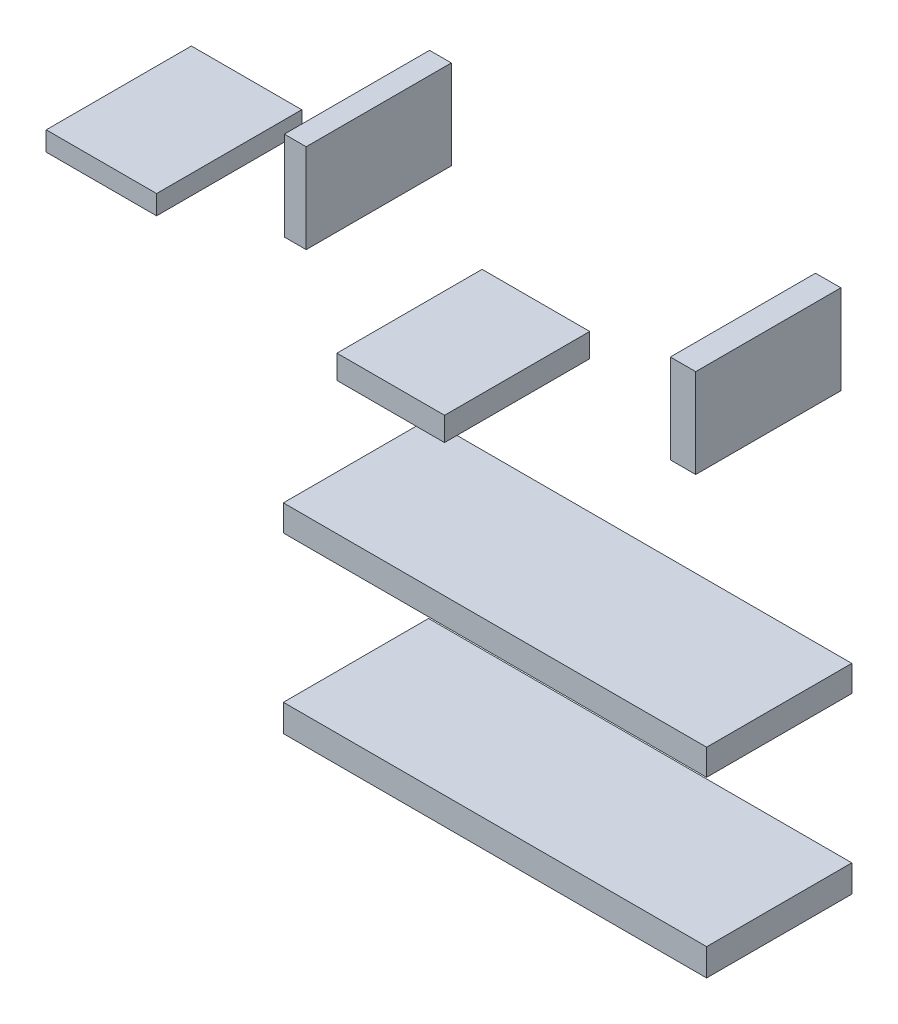
ISO-10303-21;
HEADER;
FILE_DESCRIPTION(('STEP AP214'),'2;1');
FILE_NAME('part.step','',(''),(''),'','','');
FILE_SCHEMA(('AUTOMOTIVE_DESIGN { 1 0 10303 214 1 1 1 1 }'));
ENDSEC;
DATA;
#1=APPLICATION_CONTEXT('core data for automotive mechanical design processes');
#2=APPLICATION_PROTOCOL_DEFINITION('international standard','automotive_design',2000,#1);
#3=PRODUCT_CONTEXT('',#1,'mechanical');
#4=PRODUCT('Part','Part','',(#3));
#5=PRODUCT_RELATED_PRODUCT_CATEGORY('part','',(#4));
#6=PRODUCT_DEFINITION_FORMATION('','',#4);
#7=PRODUCT_DEFINITION_CONTEXT('part definition',#1,'design');
#8=PRODUCT_DEFINITION('design','',#6,#7);
#9=PRODUCT_DEFINITION_SHAPE('','',#8);
#10=(LENGTH_UNIT() NAMED_UNIT(*) SI_UNIT(.MILLI.,.METRE.));
#11=(NAMED_UNIT(*) PLANE_ANGLE_UNIT() SI_UNIT($,.RADIAN.));
#12=(NAMED_UNIT(*) SI_UNIT($,.STERADIAN.) SOLID_ANGLE_UNIT());
#13=UNCERTAINTY_MEASURE_WITH_UNIT(LENGTH_MEASURE(1.E-05),#10,'distance_accuracy_value','');
#14=(GEOMETRIC_REPRESENTATION_CONTEXT(3) GLOBAL_UNCERTAINTY_ASSIGNED_CONTEXT((#13)) GLOBAL_UNIT_ASSIGNED_CONTEXT((#10,
#11,#12)) REPRESENTATION_CONTEXT('',''));
#15=CARTESIAN_POINT('',(0.,0.,0.));
#16=DIRECTION('',(0.,0.,1.));
#17=DIRECTION('',(1.,0.,0.));
#18=AXIS2_PLACEMENT_3D('',#15,#16,#17);
#19=CARTESIAN_POINT('',(-5.75548162999998,-30.9664164103359,-13.));
#20=DIRECTION('',(-1.,0.,0.));
#21=DIRECTION('',(0.,0.,1.));
#22=AXIS2_PLACEMENT_3D('',#19,#20,#21);
#23=PLANE('',#22);
#24=DIRECTION('',(0.,-1.,0.));
#25=VECTOR('',#24,1.);
#26=CARTESIAN_POINT('',(-5.75548162999998,-30.9664164103359,0.));
#27=LINE('',#26,#25);
#28=CARTESIAN_POINT('',(-5.75548162999998,-30.9664164103359,0.));
#29=VERTEX_POINT('',#28);
#30=CARTESIAN_POINT('',(-5.75548162999998,-33.4,0.));
#31=VERTEX_POINT('',#30);
#32=EDGE_CURVE('E107',#29,#31,#27,.T.);
#33=ORIENTED_EDGE('',*,*,#32,.F.);
#34=DIRECTION('',(0.,0.,1.));
#35=VECTOR('',#34,1.);
#36=CARTESIAN_POINT('',(-5.75548162999998,-30.9664164103359,-13.));
#37=LINE('',#36,#35);
#38=CARTESIAN_POINT('',(-5.75548162999998,-30.9664164103359,-13.));
#39=VERTEX_POINT('',#38);
#40=EDGE_CURVE('E12',#39,#29,#37,.T.);
#41=ORIENTED_EDGE('',*,*,#40,.F.);
#42=DIRECTION('',(0.,-1.,0.));
#43=VECTOR('',#42,1.);
#44=CARTESIAN_POINT('',(-5.75548162999998,-30.9664164103359,-13.));
#45=LINE('',#44,#43);
#46=CARTESIAN_POINT('',(-5.75548162999998,-33.4,-13.));
#47=VERTEX_POINT('',#46);
#48=EDGE_CURVE('E101',#39,#47,#45,.T.);
#49=ORIENTED_EDGE('',*,*,#48,.T.);
#50=DIRECTION('',(0.,0.,1.));
#51=VECTOR('',#50,1.);
#52=CARTESIAN_POINT('',(-5.75548162999998,-33.4,-13.));
#53=LINE('',#52,#51);
#54=EDGE_CURVE('E46',#47,#31,#53,.T.);
#55=ORIENTED_EDGE('',*,*,#54,.T.);
#56=EDGE_LOOP('',(#33,#41,#49,#55));
#57=FACE_BOUND('',#56,.T.);
#58=ADVANCED_FACE('F43',(#57),#23,.T.);
#59=CARTESIAN_POINT('',(-5.75548162999998,-30.9664164103359,-13.));
#60=DIRECTION('',(0.,1.,0.));
#61=DIRECTION('',(0.,0.,1.));
#62=AXIS2_PLACEMENT_3D('',#59,#60,#61);
#63=PLANE('',#62);
#64=DIRECTION('',(-1.,0.,0.));
#65=VECTOR('',#64,1.);
#66=CARTESIAN_POINT('',(-5.75548162999998,-30.9664164103359,0.));
#67=LINE('',#66,#65);
#68=CARTESIAN_POINT('',(32.14451837,-30.9664164103359,0.));
#69=VERTEX_POINT('',#68);
#70=EDGE_CURVE('E103',#69,#29,#67,.T.);
#71=ORIENTED_EDGE('',*,*,#70,.F.);
#72=DIRECTION('',(0.,0.,1.));
#73=VECTOR('',#72,1.);
#74=CARTESIAN_POINT('',(32.14451837,-30.9664164103359,-13.));
#75=LINE('',#74,#73);
#76=CARTESIAN_POINT('',(32.14451837,-30.9664164103359,-13.));
#77=VERTEX_POINT('',#76);
#78=EDGE_CURVE('E52',#77,#69,#75,.T.);
#79=ORIENTED_EDGE('',*,*,#78,.F.);
#80=DIRECTION('',(-1.,0.,0.));
#81=VECTOR('',#80,1.);
#82=CARTESIAN_POINT('',(-5.75548162999998,-30.9664164103359,-13.));
#83=LINE('',#82,#81);
#84=EDGE_CURVE('E98',#77,#39,#83,.T.);
#85=ORIENTED_EDGE('',*,*,#84,.T.);
#86=ORIENTED_EDGE('',*,*,#40,.T.);
#87=EDGE_LOOP('',(#71,#79,#85,#86));
#88=FACE_BOUND('',#87,.T.);
#89=ADVANCED_FACE('F117',(#88),#63,.T.);
#90=CARTESIAN_POINT('',(32.14451837,-30.9664164103359,-13.));
#91=DIRECTION('',(1.,0.,0.));
#92=DIRECTION('',(0.,0.,-1.));
#93=AXIS2_PLACEMENT_3D('',#90,#91,#92);
#94=PLANE('',#93);
#95=DIRECTION('',(0.,1.,0.));
#96=VECTOR('',#95,1.);
#97=CARTESIAN_POINT('',(32.14451837,-30.9664164103359,0.));
#98=LINE('',#97,#96);
#99=CARTESIAN_POINT('',(32.14451837,-33.4,0.));
#100=VERTEX_POINT('',#99);
#101=EDGE_CURVE('E93',#100,#69,#98,.T.);
#102=ORIENTED_EDGE('',*,*,#101,.F.);
#103=DIRECTION('',(0.,0.,1.));
#104=VECTOR('',#103,1.);
#105=CARTESIAN_POINT('',(32.14451837,-33.4,-13.));
#106=LINE('',#105,#104);
#107=CARTESIAN_POINT('',(32.14451837,-33.4,-13.));
#108=VERTEX_POINT('',#107);
#109=EDGE_CURVE('E88',#108,#100,#106,.T.);
#110=ORIENTED_EDGE('',*,*,#109,.F.);
#111=DIRECTION('',(0.,1.,0.));
#112=VECTOR('',#111,1.);
#113=CARTESIAN_POINT('',(32.14451837,-30.9664164103359,-13.));
#114=LINE('',#113,#112);
#115=EDGE_CURVE('E91',#108,#77,#114,.T.);
#116=ORIENTED_EDGE('',*,*,#115,.T.);
#117=ORIENTED_EDGE('',*,*,#78,.T.);
#118=EDGE_LOOP('',(#102,#110,#116,#117));
#119=FACE_BOUND('',#118,.T.);
#120=ADVANCED_FACE('F90',(#119),#94,.T.);
#121=CARTESIAN_POINT('',(-5.75548162999998,-33.4,-13.));
#122=DIRECTION('',(0.,-1.,0.));
#123=DIRECTION('',(0.,0.,-1.));
#124=AXIS2_PLACEMENT_3D('',#121,#122,#123);
#125=PLANE('',#124);
#126=DIRECTION('',(1.,0.,0.));
#127=VECTOR('',#126,1.);
#128=CARTESIAN_POINT('',(-5.75548162999998,-33.4,0.));
#129=LINE('',#128,#127);
#130=EDGE_CURVE('E110',#31,#100,#129,.T.);
#131=ORIENTED_EDGE('',*,*,#130,.F.);
#132=ORIENTED_EDGE('',*,*,#54,.F.);
#133=DIRECTION('',(1.,0.,0.));
#134=VECTOR('',#133,1.);
#135=CARTESIAN_POINT('',(-5.75548162999998,-33.4,-13.));
#136=LINE('',#135,#134);
#137=EDGE_CURVE('E97',#47,#108,#136,.T.);
#138=ORIENTED_EDGE('',*,*,#137,.T.);
#139=ORIENTED_EDGE('',*,*,#109,.T.);
#140=EDGE_LOOP('',(#131,#132,#138,#139));
#141=FACE_BOUND('',#140,.T.);
#142=ADVANCED_FACE('F100',(#141),#125,.T.);
#143=CARTESIAN_POINT('',(0.,0.,-13.));
#144=DIRECTION('',(0.,0.,1.));
#145=DIRECTION('',(1.,0.,0.));
#146=AXIS2_PLACEMENT_3D('',#143,#144,#145);
#147=PLANE('',#146);
#148=ORIENTED_EDGE('',*,*,#48,.F.);
#149=ORIENTED_EDGE('',*,*,#84,.F.);
#150=ORIENTED_EDGE('',*,*,#115,.F.);
#151=ORIENTED_EDGE('',*,*,#137,.F.);
#152=EDGE_LOOP('',(#148,#149,#150,#151));
#153=FACE_BOUND('',#152,.T.);
#154=ADVANCED_FACE('F96',(#153),#147,.F.);
#155=CARTESIAN_POINT('',(0.,0.,0.));
#156=DIRECTION('',(0.,0.,1.));
#157=DIRECTION('',(1.,0.,0.));
#158=AXIS2_PLACEMENT_3D('',#155,#156,#157);
#159=PLANE('',#158);
#160=ORIENTED_EDGE('',*,*,#32,.T.);
#161=ORIENTED_EDGE('',*,*,#130,.T.);
#162=ORIENTED_EDGE('',*,*,#101,.T.);
#163=ORIENTED_EDGE('',*,*,#70,.T.);
#164=EDGE_LOOP('',(#160,#161,#162,#163));
#165=FACE_BOUND('',#164,.T.);
#166=ADVANCED_FACE('F116',(#165),#159,.T.);
#167=CLOSED_SHELL('',(#58,#89,#120,#142,#154,#166));
#168=MANIFOLD_SOLID_BREP('B2',#167);
#169=CARTESIAN_POINT('',(-5.75548162999998,-15.5,-13.));
#170=DIRECTION('',(-1.,0.,0.));
#171=DIRECTION('',(0.,0.,1.));
#172=AXIS2_PLACEMENT_3D('',#169,#170,#171);
#173=PLANE('',#172);
#174=DIRECTION('',(0.,-1.,0.));
#175=VECTOR('',#174,1.);
#176=CARTESIAN_POINT('',(-5.75548162999998,-15.5,0.));
#177=LINE('',#176,#175);
#178=CARTESIAN_POINT('',(-5.75548162999998,-15.5,0.));
#179=VERTEX_POINT('',#178);
#180=CARTESIAN_POINT('',(-5.75548162999998,-17.84,0.));
#181=VERTEX_POINT('',#180);
#182=EDGE_CURVE('E240',#179,#181,#177,.T.);
#183=ORIENTED_EDGE('',*,*,#182,.F.);
#184=DIRECTION('',(0.,0.,1.));
#185=VECTOR('',#184,1.);
#186=CARTESIAN_POINT('',(-5.75548162999998,-15.5,-13.));
#187=LINE('',#186,#185);
#188=CARTESIAN_POINT('',(-5.75548162999998,-15.5,-13.));
#189=VERTEX_POINT('',#188);
#190=EDGE_CURVE('E41',#189,#179,#187,.T.);
#191=ORIENTED_EDGE('',*,*,#190,.F.);
#192=DIRECTION('',(0.,-1.,0.));
#193=VECTOR('',#192,1.);
#194=CARTESIAN_POINT('',(-5.75548162999998,-15.5,-13.));
#195=LINE('',#194,#193);
#196=CARTESIAN_POINT('',(-5.75548162999998,-17.84,-13.));
#197=VERTEX_POINT('',#196);
#198=EDGE_CURVE('E234',#189,#197,#195,.T.);
#199=ORIENTED_EDGE('',*,*,#198,.T.);
#200=DIRECTION('',(0.,0.,1.));
#201=VECTOR('',#200,1.);
#202=CARTESIAN_POINT('',(-5.75548162999998,-17.84,-13.));
#203=LINE('',#202,#201);
#204=EDGE_CURVE('E179',#197,#181,#203,.T.);
#205=ORIENTED_EDGE('',*,*,#204,.T.);
#206=EDGE_LOOP('',(#183,#191,#199,#205));
#207=FACE_BOUND('',#206,.T.);
#208=ADVANCED_FACE('F176',(#207),#173,.T.);
#209=CARTESIAN_POINT('',(-5.75548162999998,-15.5,-13.));
#210=DIRECTION('',(0.,1.,0.));
#211=DIRECTION('',(0.,0.,1.));
#212=AXIS2_PLACEMENT_3D('',#209,#210,#211);
#213=PLANE('',#212);
#214=DIRECTION('',(-1.,0.,0.));
#215=VECTOR('',#214,1.);
#216=CARTESIAN_POINT('',(-5.75548162999998,-15.5,0.));
#217=LINE('',#216,#215);
#218=CARTESIAN_POINT('',(32.14451837,-15.5,0.));
#219=VERTEX_POINT('',#218);
#220=EDGE_CURVE('E236',#219,#179,#217,.T.);
#221=ORIENTED_EDGE('',*,*,#220,.F.);
#222=DIRECTION('',(0.,0.,1.));
#223=VECTOR('',#222,1.);
#224=CARTESIAN_POINT('',(32.14451837,-15.5,-13.));
#225=LINE('',#224,#223);
#226=CARTESIAN_POINT('',(32.14451837,-15.5,-13.));
#227=VERTEX_POINT('',#226);
#228=EDGE_CURVE('E185',#227,#219,#225,.T.);
#229=ORIENTED_EDGE('',*,*,#228,.F.);
#230=DIRECTION('',(-1.,0.,0.));
#231=VECTOR('',#230,1.);
#232=CARTESIAN_POINT('',(-5.75548162999998,-15.5,-13.));
#233=LINE('',#232,#231);
#234=EDGE_CURVE('E231',#227,#189,#233,.T.);
#235=ORIENTED_EDGE('',*,*,#234,.T.);
#236=ORIENTED_EDGE('',*,*,#190,.T.);
#237=EDGE_LOOP('',(#221,#229,#235,#236));
#238=FACE_BOUND('',#237,.T.);
#239=ADVANCED_FACE('F250',(#238),#213,.T.);
#240=CARTESIAN_POINT('',(32.14451837,-15.5,-13.));
#241=DIRECTION('',(1.,0.,0.));
#242=DIRECTION('',(0.,0.,-1.));
#243=AXIS2_PLACEMENT_3D('',#240,#241,#242);
#244=PLANE('',#243);
#245=DIRECTION('',(0.,1.,0.));
#246=VECTOR('',#245,1.);
#247=CARTESIAN_POINT('',(32.14451837,-15.5,0.));
#248=LINE('',#247,#246);
#249=CARTESIAN_POINT('',(32.14451837,-17.84,0.));
#250=VERTEX_POINT('',#249);
#251=EDGE_CURVE('E226',#250,#219,#248,.T.);
#252=ORIENTED_EDGE('',*,*,#251,.F.);
#253=DIRECTION('',(0.,0.,1.));
#254=VECTOR('',#253,1.);
#255=CARTESIAN_POINT('',(32.14451837,-17.84,-13.));
#256=LINE('',#255,#254);
#257=CARTESIAN_POINT('',(32.14451837,-17.84,-13.));
#258=VERTEX_POINT('',#257);
#259=EDGE_CURVE('E221',#258,#250,#256,.T.);
#260=ORIENTED_EDGE('',*,*,#259,.F.);
#261=DIRECTION('',(0.,1.,0.));
#262=VECTOR('',#261,1.);
#263=CARTESIAN_POINT('',(32.14451837,-15.5,-13.));
#264=LINE('',#263,#262);
#265=EDGE_CURVE('E224',#258,#227,#264,.T.);
#266=ORIENTED_EDGE('',*,*,#265,.T.);
#267=ORIENTED_EDGE('',*,*,#228,.T.);
#268=EDGE_LOOP('',(#252,#260,#266,#267));
#269=FACE_BOUND('',#268,.T.);
#270=ADVANCED_FACE('F223',(#269),#244,.T.);
#271=CARTESIAN_POINT('',(-5.75548162999998,-17.84,-13.));
#272=DIRECTION('',(0.,-1.,0.));
#273=DIRECTION('',(0.,0.,-1.));
#274=AXIS2_PLACEMENT_3D('',#271,#272,#273);
#275=PLANE('',#274);
#276=DIRECTION('',(1.,0.,0.));
#277=VECTOR('',#276,1.);
#278=CARTESIAN_POINT('',(-5.75548162999998,-17.84,0.));
#279=LINE('',#278,#277);
#280=EDGE_CURVE('E243',#181,#250,#279,.T.);
#281=ORIENTED_EDGE('',*,*,#280,.F.);
#282=ORIENTED_EDGE('',*,*,#204,.F.);
#283=DIRECTION('',(1.,0.,0.));
#284=VECTOR('',#283,1.);
#285=CARTESIAN_POINT('',(-5.75548162999998,-17.84,-13.));
#286=LINE('',#285,#284);
#287=EDGE_CURVE('E230',#197,#258,#286,.T.);
#288=ORIENTED_EDGE('',*,*,#287,.T.);
#289=ORIENTED_EDGE('',*,*,#259,.T.);
#290=EDGE_LOOP('',(#281,#282,#288,#289));
#291=FACE_BOUND('',#290,.T.);
#292=ADVANCED_FACE('F233',(#291),#275,.T.);
#293=CARTESIAN_POINT('',(0.,0.,-13.));
#294=DIRECTION('',(0.,0.,1.));
#295=DIRECTION('',(1.,0.,0.));
#296=AXIS2_PLACEMENT_3D('',#293,#294,#295);
#297=PLANE('',#296);
#298=ORIENTED_EDGE('',*,*,#198,.F.);
#299=ORIENTED_EDGE('',*,*,#234,.F.);
#300=ORIENTED_EDGE('',*,*,#265,.F.);
#301=ORIENTED_EDGE('',*,*,#287,.F.);
#302=EDGE_LOOP('',(#298,#299,#300,#301));
#303=FACE_BOUND('',#302,.T.);
#304=ADVANCED_FACE('F229',(#303),#297,.F.);
#305=CARTESIAN_POINT('',(0.,0.,0.));
#306=DIRECTION('',(0.,0.,1.));
#307=DIRECTION('',(1.,0.,0.));
#308=AXIS2_PLACEMENT_3D('',#305,#306,#307);
#309=PLANE('',#308);
#310=ORIENTED_EDGE('',*,*,#182,.T.);
#311=ORIENTED_EDGE('',*,*,#280,.T.);
#312=ORIENTED_EDGE('',*,*,#251,.T.);
#313=ORIENTED_EDGE('',*,*,#220,.T.);
#314=EDGE_LOOP('',(#310,#311,#312,#313));
#315=FACE_BOUND('',#314,.T.);
#316=ADVANCED_FACE('F249',(#315),#309,.T.);
#317=CLOSED_SHELL('',(#208,#239,#270,#292,#304,#316));
#318=MANIFOLD_SOLID_BREP('B6',#317);
#319=CARTESIAN_POINT('',(28.8972751093144,13.1375005908331,-13.));
#320=DIRECTION('',(-1.,0.,0.));
#321=DIRECTION('',(0.,0.,1.));
#322=AXIS2_PLACEMENT_3D('',#319,#320,#321);
#323=PLANE('',#322);
#324=DIRECTION('',(0.,-1.,0.));
#325=VECTOR('',#324,1.);
#326=CARTESIAN_POINT('',(28.8972751093144,13.1375005908331,0.));
#327=LINE('',#326,#325);
#328=CARTESIAN_POINT('',(28.8972751093144,13.1375005908331,0.));
#329=VERTEX_POINT('',#328);
#330=CARTESIAN_POINT('',(28.8972751093144,5.15433496295749,0.));
#331=VERTEX_POINT('',#330);
#332=EDGE_CURVE('E373',#329,#331,#327,.T.);
#333=ORIENTED_EDGE('',*,*,#332,.F.);
#334=DIRECTION('',(0.,0.,1.));
#335=VECTOR('',#334,1.);
#336=CARTESIAN_POINT('',(28.8972751093144,13.1375005908331,-13.));
#337=LINE('',#336,#335);
#338=CARTESIAN_POINT('',(28.8972751093144,13.1375005908331,-13.));
#339=VERTEX_POINT('',#338);
#340=EDGE_CURVE('E174',#339,#329,#337,.T.);
#341=ORIENTED_EDGE('',*,*,#340,.F.);
#342=DIRECTION('',(0.,-1.,0.));
#343=VECTOR('',#342,1.);
#344=CARTESIAN_POINT('',(28.8972751093144,13.1375005908331,-13.));
#345=LINE('',#344,#343);
#346=CARTESIAN_POINT('',(28.8972751093144,5.15433496295749,-13.));
#347=VERTEX_POINT('',#346);
#348=EDGE_CURVE('E367',#339,#347,#345,.T.);
#349=ORIENTED_EDGE('',*,*,#348,.T.);
#350=DIRECTION('',(0.,0.,1.));
#351=VECTOR('',#350,1.);
#352=CARTESIAN_POINT('',(28.8972751093144,5.15433496295749,-13.));
#353=LINE('',#352,#351);
#354=EDGE_CURVE('E312',#347,#331,#353,.T.);
#355=ORIENTED_EDGE('',*,*,#354,.T.);
#356=EDGE_LOOP('',(#333,#341,#349,#355));
#357=FACE_BOUND('',#356,.T.);
#358=ADVANCED_FACE('F309',(#357),#323,.T.);
#359=CARTESIAN_POINT('',(28.8972751093144,13.1375005908331,-13.));
#360=DIRECTION('',(0.,1.,0.));
#361=DIRECTION('',(0.,0.,1.));
#362=AXIS2_PLACEMENT_3D('',#359,#360,#361);
#363=PLANE('',#362);
#364=DIRECTION('',(-1.,0.,0.));
#365=VECTOR('',#364,1.);
#366=CARTESIAN_POINT('',(28.8972751093144,13.1375005908331,0.));
#367=LINE('',#366,#365);
#368=CARTESIAN_POINT('',(31.1665691583331,13.1375005908331,0.));
#369=VERTEX_POINT('',#368);
#370=EDGE_CURVE('E369',#369,#329,#367,.T.);
#371=ORIENTED_EDGE('',*,*,#370,.F.);
#372=DIRECTION('',(0.,0.,1.));
#373=VECTOR('',#372,1.);
#374=CARTESIAN_POINT('',(31.1665691583331,13.1375005908331,-13.));
#375=LINE('',#374,#373);
#376=CARTESIAN_POINT('',(31.1665691583331,13.1375005908331,-13.));
#377=VERTEX_POINT('',#376);
#378=EDGE_CURVE('E318',#377,#369,#375,.T.);
#379=ORIENTED_EDGE('',*,*,#378,.F.);
#380=DIRECTION('',(-1.,0.,0.));
#381=VECTOR('',#380,1.);
#382=CARTESIAN_POINT('',(28.8972751093144,13.1375005908331,-13.));
#383=LINE('',#382,#381);
#384=EDGE_CURVE('E364',#377,#339,#383,.T.);
#385=ORIENTED_EDGE('',*,*,#384,.T.);
#386=ORIENTED_EDGE('',*,*,#340,.T.);
#387=EDGE_LOOP('',(#371,#379,#385,#386));
#388=FACE_BOUND('',#387,.T.);
#389=ADVANCED_FACE('F383',(#388),#363,.T.);
#390=CARTESIAN_POINT('',(31.1665691583331,13.1375005908331,-13.));
#391=DIRECTION('',(1.,0.,0.));
#392=DIRECTION('',(0.,0.,-1.));
#393=AXIS2_PLACEMENT_3D('',#390,#391,#392);
#394=PLANE('',#393);
#395=DIRECTION('',(0.,1.,0.));
#396=VECTOR('',#395,1.);
#397=CARTESIAN_POINT('',(31.1665691583331,13.1375005908331,0.));
#398=LINE('',#397,#396);
#399=CARTESIAN_POINT('',(31.1665691583331,5.15433496295749,0.));
#400=VERTEX_POINT('',#399);
#401=EDGE_CURVE('E359',#400,#369,#398,.T.);
#402=ORIENTED_EDGE('',*,*,#401,.F.);
#403=DIRECTION('',(0.,0.,1.));
#404=VECTOR('',#403,1.);
#405=CARTESIAN_POINT('',(31.1665691583331,5.15433496295749,-13.));
#406=LINE('',#405,#404);
#407=CARTESIAN_POINT('',(31.1665691583331,5.15433496295749,-13.));
#408=VERTEX_POINT('',#407);
#409=EDGE_CURVE('E354',#408,#400,#406,.T.);
#410=ORIENTED_EDGE('',*,*,#409,.F.);
#411=DIRECTION('',(0.,1.,0.));
#412=VECTOR('',#411,1.);
#413=CARTESIAN_POINT('',(31.1665691583331,13.1375005908331,-13.));
#414=LINE('',#413,#412);
#415=EDGE_CURVE('E357',#408,#377,#414,.T.);
#416=ORIENTED_EDGE('',*,*,#415,.T.);
#417=ORIENTED_EDGE('',*,*,#378,.T.);
#418=EDGE_LOOP('',(#402,#410,#416,#417));
#419=FACE_BOUND('',#418,.T.);
#420=ADVANCED_FACE('F356',(#419),#394,.T.);
#421=CARTESIAN_POINT('',(28.8972751093144,5.15433496295749,-13.));
#422=DIRECTION('',(0.,-1.,0.));
#423=DIRECTION('',(0.,0.,-1.));
#424=AXIS2_PLACEMENT_3D('',#421,#422,#423);
#425=PLANE('',#424);
#426=DIRECTION('',(1.,0.,0.));
#427=VECTOR('',#426,1.);
#428=CARTESIAN_POINT('',(28.8972751093144,5.15433496295749,0.));
#429=LINE('',#428,#427);
#430=EDGE_CURVE('E376',#331,#400,#429,.T.);
#431=ORIENTED_EDGE('',*,*,#430,.F.);
#432=ORIENTED_EDGE('',*,*,#354,.F.);
#433=DIRECTION('',(1.,0.,0.));
#434=VECTOR('',#433,1.);
#435=CARTESIAN_POINT('',(28.8972751093144,5.15433496295749,-13.));
#436=LINE('',#435,#434);
#437=EDGE_CURVE('E363',#347,#408,#436,.T.);
#438=ORIENTED_EDGE('',*,*,#437,.T.);
#439=ORIENTED_EDGE('',*,*,#409,.T.);
#440=EDGE_LOOP('',(#431,#432,#438,#439));
#441=FACE_BOUND('',#440,.T.);
#442=ADVANCED_FACE('F366',(#441),#425,.T.);
#443=CARTESIAN_POINT('',(0.,0.,-13.));
#444=DIRECTION('',(0.,0.,1.));
#445=DIRECTION('',(1.,0.,0.));
#446=AXIS2_PLACEMENT_3D('',#443,#444,#445);
#447=PLANE('',#446);
#448=ORIENTED_EDGE('',*,*,#348,.F.);
#449=ORIENTED_EDGE('',*,*,#384,.F.);
#450=ORIENTED_EDGE('',*,*,#415,.F.);
#451=ORIENTED_EDGE('',*,*,#437,.F.);
#452=EDGE_LOOP('',(#448,#449,#450,#451));
#453=FACE_BOUND('',#452,.T.);
#454=ADVANCED_FACE('F362',(#453),#447,.F.);
#455=CARTESIAN_POINT('',(0.,0.,0.));
#456=DIRECTION('',(0.,0.,1.));
#457=DIRECTION('',(1.,0.,0.));
#458=AXIS2_PLACEMENT_3D('',#455,#456,#457);
#459=PLANE('',#458);
#460=ORIENTED_EDGE('',*,*,#332,.T.);
#461=ORIENTED_EDGE('',*,*,#430,.T.);
#462=ORIENTED_EDGE('',*,*,#401,.T.);
#463=ORIENTED_EDGE('',*,*,#370,.T.);
#464=EDGE_LOOP('',(#460,#461,#462,#463));
#465=FACE_BOUND('',#464,.T.);
#466=ADVANCED_FACE('F382',(#465),#459,.T.);
#467=CLOSED_SHELL('',(#358,#389,#420,#442,#454,#466));
#468=MANIFOLD_SOLID_BREP('B35',#467);
#469=CARTESIAN_POINT('',(-5.66932694659635,13.1375005908331,-13.));
#470=DIRECTION('',(-1.,0.,0.));
#471=DIRECTION('',(0.,0.,1.));
#472=AXIS2_PLACEMENT_3D('',#469,#470,#471);
#473=PLANE('',#472);
#474=DIRECTION('',(0.,-1.,0.));
#475=VECTOR('',#474,1.);
#476=CARTESIAN_POINT('',(-5.66932694659635,13.1375005908331,0.));
#477=LINE('',#476,#475);
#478=CARTESIAN_POINT('',(-5.66932694659635,13.1375005908331,0.));
#479=VERTEX_POINT('',#478);
#480=CARTESIAN_POINT('',(-5.66932694659635,5.15433496295749,0.));
#481=VERTEX_POINT('',#480);
#482=EDGE_CURVE('E506',#479,#481,#477,.T.);
#483=ORIENTED_EDGE('',*,*,#482,.F.);
#484=DIRECTION('',(0.,0.,1.));
#485=VECTOR('',#484,1.);
#486=CARTESIAN_POINT('',(-5.66932694659635,13.1375005908331,-13.));
#487=LINE('',#486,#485);
#488=CARTESIAN_POINT('',(-5.66932694659635,13.1375005908331,-13.));
#489=VERTEX_POINT('',#488);
#490=EDGE_CURVE('E307',#489,#479,#487,.T.);
#491=ORIENTED_EDGE('',*,*,#490,.F.);
#492=DIRECTION('',(0.,-1.,0.));
#493=VECTOR('',#492,1.);
#494=CARTESIAN_POINT('',(-5.66932694659635,13.1375005908331,-13.));
#495=LINE('',#494,#493);
#496=CARTESIAN_POINT('',(-5.66932694659635,5.15433496295749,-13.));
#497=VERTEX_POINT('',#496);
#498=EDGE_CURVE('E500',#489,#497,#495,.T.);
#499=ORIENTED_EDGE('',*,*,#498,.T.);
#500=DIRECTION('',(0.,0.,1.));
#501=VECTOR('',#500,1.);
#502=CARTESIAN_POINT('',(-5.66932694659635,5.15433496295749,-13.));
#503=LINE('',#502,#501);
#504=EDGE_CURVE('E445',#497,#481,#503,.T.);
#505=ORIENTED_EDGE('',*,*,#504,.T.);
#506=EDGE_LOOP('',(#483,#491,#499,#505));
#507=FACE_BOUND('',#506,.T.);
#508=ADVANCED_FACE('F442',(#507),#473,.T.);
#509=CARTESIAN_POINT('',(-5.66932694659635,13.1375005908331,-13.));
#510=DIRECTION('',(0.,1.,0.));
#511=DIRECTION('',(0.,0.,1.));
#512=AXIS2_PLACEMENT_3D('',#509,#510,#511);
#513=PLANE('',#512);
#514=DIRECTION('',(-1.,0.,0.));
#515=VECTOR('',#514,1.);
#516=CARTESIAN_POINT('',(-5.66932694659635,13.1375005908331,0.));
#517=LINE('',#516,#515);
#518=CARTESIAN_POINT('',(-3.71540528942401,13.1375005908331,0.));
#519=VERTEX_POINT('',#518);
#520=EDGE_CURVE('E502',#519,#479,#517,.T.);
#521=ORIENTED_EDGE('',*,*,#520,.F.);
#522=DIRECTION('',(0.,0.,1.));
#523=VECTOR('',#522,1.);
#524=CARTESIAN_POINT('',(-3.71540528942401,13.1375005908331,-13.));
#525=LINE('',#524,#523);
#526=CARTESIAN_POINT('',(-3.71540528942401,13.1375005908331,-13.));
#527=VERTEX_POINT('',#526);
#528=EDGE_CURVE('E451',#527,#519,#525,.T.);
#529=ORIENTED_EDGE('',*,*,#528,.F.);
#530=DIRECTION('',(-1.,0.,0.));
#531=VECTOR('',#530,1.);
#532=CARTESIAN_POINT('',(-5.66932694659635,13.1375005908331,-13.));
#533=LINE('',#532,#531);
#534=EDGE_CURVE('E497',#527,#489,#533,.T.);
#535=ORIENTED_EDGE('',*,*,#534,.T.);
#536=ORIENTED_EDGE('',*,*,#490,.T.);
#537=EDGE_LOOP('',(#521,#529,#535,#536));
#538=FACE_BOUND('',#537,.T.);
#539=ADVANCED_FACE('F516',(#538),#513,.T.);
#540=CARTESIAN_POINT('',(-3.71540528942401,13.1375005908331,-13.));
#541=DIRECTION('',(1.,0.,0.));
#542=DIRECTION('',(0.,0.,-1.));
#543=AXIS2_PLACEMENT_3D('',#540,#541,#542);
#544=PLANE('',#543);
#545=DIRECTION('',(0.,1.,0.));
#546=VECTOR('',#545,1.);
#547=CARTESIAN_POINT('',(-3.71540528942401,13.1375005908331,0.));
#548=LINE('',#547,#546);
#549=CARTESIAN_POINT('',(-3.71540528942401,5.15433496295749,0.));
#550=VERTEX_POINT('',#549);
#551=EDGE_CURVE('E492',#550,#519,#548,.T.);
#552=ORIENTED_EDGE('',*,*,#551,.F.);
#553=DIRECTION('',(0.,0.,1.));
#554=VECTOR('',#553,1.);
#555=CARTESIAN_POINT('',(-3.71540528942401,5.15433496295749,-13.));
#556=LINE('',#555,#554);
#557=CARTESIAN_POINT('',(-3.71540528942401,5.15433496295749,-13.));
#558=VERTEX_POINT('',#557);
#559=EDGE_CURVE('E487',#558,#550,#556,.T.);
#560=ORIENTED_EDGE('',*,*,#559,.F.);
#561=DIRECTION('',(0.,1.,0.));
#562=VECTOR('',#561,1.);
#563=CARTESIAN_POINT('',(-3.71540528942401,13.1375005908331,-13.));
#564=LINE('',#563,#562);
#565=EDGE_CURVE('E490',#558,#527,#564,.T.);
#566=ORIENTED_EDGE('',*,*,#565,.T.);
#567=ORIENTED_EDGE('',*,*,#528,.T.);
#568=EDGE_LOOP('',(#552,#560,#566,#567));
#569=FACE_BOUND('',#568,.T.);
#570=ADVANCED_FACE('F489',(#569),#544,.T.);
#571=CARTESIAN_POINT('',(-5.66932694659635,5.15433496295749,-13.));
#572=DIRECTION('',(0.,-1.,0.));
#573=DIRECTION('',(0.,0.,-1.));
#574=AXIS2_PLACEMENT_3D('',#571,#572,#573);
#575=PLANE('',#574);
#576=DIRECTION('',(1.,0.,0.));
#577=VECTOR('',#576,1.);
#578=CARTESIAN_POINT('',(-5.66932694659635,5.15433496295749,0.));
#579=LINE('',#578,#577);
#580=EDGE_CURVE('E509',#481,#550,#579,.T.);
#581=ORIENTED_EDGE('',*,*,#580,.F.);
#582=ORIENTED_EDGE('',*,*,#504,.F.);
#583=DIRECTION('',(1.,0.,0.));
#584=VECTOR('',#583,1.);
#585=CARTESIAN_POINT('',(-5.66932694659635,5.15433496295749,-13.));
#586=LINE('',#585,#584);
#587=EDGE_CURVE('E496',#497,#558,#586,.T.);
#588=ORIENTED_EDGE('',*,*,#587,.T.);
#589=ORIENTED_EDGE('',*,*,#559,.T.);
#590=EDGE_LOOP('',(#581,#582,#588,#589));
#591=FACE_BOUND('',#590,.T.);
#592=ADVANCED_FACE('F499',(#591),#575,.T.);
#593=CARTESIAN_POINT('',(0.,0.,-13.));
#594=DIRECTION('',(0.,0.,1.));
#595=DIRECTION('',(1.,0.,0.));
#596=AXIS2_PLACEMENT_3D('',#593,#594,#595);
#597=PLANE('',#596);
#598=ORIENTED_EDGE('',*,*,#498,.F.);
#599=ORIENTED_EDGE('',*,*,#534,.F.);
#600=ORIENTED_EDGE('',*,*,#565,.F.);
#601=ORIENTED_EDGE('',*,*,#587,.F.);
#602=EDGE_LOOP('',(#598,#599,#600,#601));
#603=FACE_BOUND('',#602,.T.);
#604=ADVANCED_FACE('F495',(#603),#597,.F.);
#605=CARTESIAN_POINT('',(0.,0.,0.));
#606=DIRECTION('',(0.,0.,1.));
#607=DIRECTION('',(1.,0.,0.));
#608=AXIS2_PLACEMENT_3D('',#605,#606,#607);
#609=PLANE('',#608);
#610=ORIENTED_EDGE('',*,*,#482,.T.);
#611=ORIENTED_EDGE('',*,*,#580,.T.);
#612=ORIENTED_EDGE('',*,*,#551,.T.);
#613=ORIENTED_EDGE('',*,*,#520,.T.);
#614=EDGE_LOOP('',(#610,#611,#612,#613));
#615=FACE_BOUND('',#614,.T.);
#616=ADVANCED_FACE('F515',(#615),#609,.T.);
#617=CLOSED_SHELL('',(#508,#539,#570,#592,#604,#616));
#618=MANIFOLD_SOLID_BREP('B168',#617);
#619=CARTESIAN_POINT('',(-26.9949861763059,2.80962897435068,-13.));
#620=DIRECTION('',(-1.,0.,0.));
#621=DIRECTION('',(0.,0.,1.));
#622=AXIS2_PLACEMENT_3D('',#619,#620,#621);
#623=PLANE('',#622);
#624=DIRECTION('',(0.,-1.,0.));
#625=VECTOR('',#624,1.);
#626=CARTESIAN_POINT('',(-26.9949861763059,2.80962897435068,0.));
#627=LINE('',#626,#625);
#628=CARTESIAN_POINT('',(-26.9949861763059,2.80962897435068,0.));
#629=VERTEX_POINT('',#628);
#630=CARTESIAN_POINT('',(-26.9949861763059,1.07678511837636,0.));
#631=VERTEX_POINT('',#630);
#632=EDGE_CURVE('E638',#629,#631,#627,.T.);
#633=ORIENTED_EDGE('',*,*,#632,.F.);
#634=DIRECTION('',(0.,0.,1.));
#635=VECTOR('',#634,1.);
#636=CARTESIAN_POINT('',(-26.9949861763059,2.80962897435068,-13.));
#637=LINE('',#636,#635);
#638=CARTESIAN_POINT('',(-26.9949861763059,2.80962897435068,-13.));
#639=VERTEX_POINT('',#638);
#640=EDGE_CURVE('E440',#639,#629,#637,.T.);
#641=ORIENTED_EDGE('',*,*,#640,.F.);
#642=DIRECTION('',(0.,-1.,0.));
#643=VECTOR('',#642,1.);
#644=CARTESIAN_POINT('',(-26.9949861763059,2.80962897435068,-13.));
#645=LINE('',#644,#643);
#646=CARTESIAN_POINT('',(-26.9949861763059,1.07678511837636,-13.));
#647=VERTEX_POINT('',#646);
#648=EDGE_CURVE('E632',#639,#647,#645,.T.);
#649=ORIENTED_EDGE('',*,*,#648,.T.);
#650=DIRECTION('',(0.,0.,1.));
#651=VECTOR('',#650,1.);
#652=CARTESIAN_POINT('',(-26.9949861763059,1.07678511837636,-13.));
#653=LINE('',#652,#651);
#654=EDGE_CURVE('E577',#647,#631,#653,.T.);
#655=ORIENTED_EDGE('',*,*,#654,.T.);
#656=EDGE_LOOP('',(#633,#641,#649,#655));
#657=FACE_BOUND('',#656,.T.);
#658=ADVANCED_FACE('F574',(#657),#623,.T.);
#659=CARTESIAN_POINT('',(-26.9949861763059,2.80962897435068,-13.));
#660=DIRECTION('',(0.,1.,0.));
#661=DIRECTION('',(0.,0.,1.));
#662=AXIS2_PLACEMENT_3D('',#659,#660,#661);
#663=PLANE('',#662);
#664=DIRECTION('',(-1.,0.,0.));
#665=VECTOR('',#664,1.);
#666=CARTESIAN_POINT('',(-26.9949861763059,2.80962897435068,0.));
#667=LINE('',#666,#665);
#668=CARTESIAN_POINT('',(-17.1114976932699,2.80962897435068,0.));
#669=VERTEX_POINT('',#668);
#670=EDGE_CURVE('E634',#669,#629,#667,.T.);
#671=ORIENTED_EDGE('',*,*,#670,.F.);
#672=DIRECTION('',(0.,0.,1.));
#673=VECTOR('',#672,1.);
#674=CARTESIAN_POINT('',(-17.1114976932699,2.80962897435068,-13.));
#675=LINE('',#674,#673);
#676=CARTESIAN_POINT('',(-17.1114976932699,2.80962897435068,-13.));
#677=VERTEX_POINT('',#676);
#678=EDGE_CURVE('E583',#677,#669,#675,.T.);
#679=ORIENTED_EDGE('',*,*,#678,.F.);
#680=DIRECTION('',(-1.,0.,0.));
#681=VECTOR('',#680,1.);
#682=CARTESIAN_POINT('',(-26.9949861763059,2.80962897435068,-13.));
#683=LINE('',#682,#681);
#684=EDGE_CURVE('E629',#677,#639,#683,.T.);
#685=ORIENTED_EDGE('',*,*,#684,.T.);
#686=ORIENTED_EDGE('',*,*,#640,.T.);
#687=EDGE_LOOP('',(#671,#679,#685,#686));
#688=FACE_BOUND('',#687,.T.);
#689=ADVANCED_FACE('F648',(#688),#663,.T.);
#690=CARTESIAN_POINT('',(-17.1114976932699,2.80962897435068,-13.));
#691=DIRECTION('',(1.,0.,0.));
#692=DIRECTION('',(0.,0.,-1.));
#693=AXIS2_PLACEMENT_3D('',#690,#691,#692);
#694=PLANE('',#693);
#695=DIRECTION('',(0.,1.,0.));
#696=VECTOR('',#695,1.);
#697=CARTESIAN_POINT('',(-17.1114976932699,2.80962897435068,0.));
#698=LINE('',#697,#696);
#699=CARTESIAN_POINT('',(-17.1114976932699,1.07678511837636,0.));
#700=VERTEX_POINT('',#699);
#701=EDGE_CURVE('E624',#700,#669,#698,.T.);
#702=ORIENTED_EDGE('',*,*,#701,.F.);
#703=DIRECTION('',(0.,0.,1.));
#704=VECTOR('',#703,1.);
#705=CARTESIAN_POINT('',(-17.1114976932699,1.07678511837636,-13.));
#706=LINE('',#705,#704);
#707=CARTESIAN_POINT('',(-17.1114976932699,1.07678511837636,-13.));
#708=VERTEX_POINT('',#707);
#709=EDGE_CURVE('E619',#708,#700,#706,.T.);
#710=ORIENTED_EDGE('',*,*,#709,.F.);
#711=DIRECTION('',(0.,1.,0.));
#712=VECTOR('',#711,1.);
#713=CARTESIAN_POINT('',(-17.1114976932699,2.80962897435068,-13.));
#714=LINE('',#713,#712);
#715=EDGE_CURVE('E622',#708,#677,#714,.T.);
#716=ORIENTED_EDGE('',*,*,#715,.T.);
#717=ORIENTED_EDGE('',*,*,#678,.T.);
#718=EDGE_LOOP('',(#702,#710,#716,#717));
#719=FACE_BOUND('',#718,.T.);
#720=ADVANCED_FACE('F621',(#719),#694,.T.);
#721=CARTESIAN_POINT('',(-26.9949861763059,1.07678511837636,-13.));
#722=DIRECTION('',(0.,-1.,0.));
#723=DIRECTION('',(0.,0.,-1.));
#724=AXIS2_PLACEMENT_3D('',#721,#722,#723);
#725=PLANE('',#724);
#726=DIRECTION('',(1.,0.,0.));
#727=VECTOR('',#726,1.);
#728=CARTESIAN_POINT('',(-26.9949861763059,1.07678511837636,0.));
#729=LINE('',#728,#727);
#730=EDGE_CURVE('E641',#631,#700,#729,.T.);
#731=ORIENTED_EDGE('',*,*,#730,.F.);
#732=ORIENTED_EDGE('',*,*,#654,.F.);
#733=DIRECTION('',(1.,0.,0.));
#734=VECTOR('',#733,1.);
#735=CARTESIAN_POINT('',(-26.9949861763059,1.07678511837636,-13.));
#736=LINE('',#735,#734);
#737=EDGE_CURVE('E628',#647,#708,#736,.T.);
#738=ORIENTED_EDGE('',*,*,#737,.T.);
#739=ORIENTED_EDGE('',*,*,#709,.T.);
#740=EDGE_LOOP('',(#731,#732,#738,#739));
#741=FACE_BOUND('',#740,.T.);
#742=ADVANCED_FACE('F631',(#741),#725,.T.);
#743=CARTESIAN_POINT('',(0.,0.,-13.));
#744=DIRECTION('',(0.,0.,1.));
#745=DIRECTION('',(1.,0.,0.));
#746=AXIS2_PLACEMENT_3D('',#743,#744,#745);
#747=PLANE('',#746);
#748=ORIENTED_EDGE('',*,*,#648,.F.);
#749=ORIENTED_EDGE('',*,*,#684,.F.);
#750=ORIENTED_EDGE('',*,*,#715,.F.);
#751=ORIENTED_EDGE('',*,*,#737,.F.);
#752=EDGE_LOOP('',(#748,#749,#750,#751));
#753=FACE_BOUND('',#752,.T.);
#754=ADVANCED_FACE('F627',(#753),#747,.F.);
#755=CARTESIAN_POINT('',(0.,0.,0.));
#756=DIRECTION('',(0.,0.,1.));
#757=DIRECTION('',(1.,0.,0.));
#758=AXIS2_PLACEMENT_3D('',#755,#756,#757);
#759=PLANE('',#758);
#760=ORIENTED_EDGE('',*,*,#632,.T.);
#761=ORIENTED_EDGE('',*,*,#730,.T.);
#762=ORIENTED_EDGE('',*,*,#701,.T.);
#763=ORIENTED_EDGE('',*,*,#670,.T.);
#764=EDGE_LOOP('',(#760,#761,#762,#763));
#765=FACE_BOUND('',#764,.T.);
#766=ADVANCED_FACE('F647',(#765),#759,.T.);
#767=CLOSED_SHELL('',(#658,#689,#720,#742,#754,#766));
#768=MANIFOLD_SOLID_BREP('B301',#767);
#769=CARTESIAN_POINT('',(-0.960936001700913,-1.49237273550123,-13.));
#770=DIRECTION('',(-1.,0.,0.));
#771=DIRECTION('',(0.,0.,1.));
#772=AXIS2_PLACEMENT_3D('',#769,#770,#771);
#773=PLANE('',#772);
#774=DIRECTION('',(0.,-1.,0.));
#775=VECTOR('',#774,1.);
#776=CARTESIAN_POINT('',(-0.960936001700913,-1.49237273550123,0.));
#777=LINE('',#776,#775);
#778=CARTESIAN_POINT('',(-0.960936001700913,-1.49237273550123,0.));
#779=VERTEX_POINT('',#778);
#780=CARTESIAN_POINT('',(-0.960936001700913,-3.61115022409148,0.));
#781=VERTEX_POINT('',#780);
#782=EDGE_CURVE('E761',#779,#781,#777,.T.);
#783=ORIENTED_EDGE('',*,*,#782,.F.);
#784=DIRECTION('',(0.,0.,1.));
#785=VECTOR('',#784,1.);
#786=CARTESIAN_POINT('',(-0.960936001700913,-1.49237273550123,-13.));
#787=LINE('',#786,#785);
#788=CARTESIAN_POINT('',(-0.960936001700913,-1.49237273550123,-13.));
#789=VERTEX_POINT('',#788);
#790=EDGE_CURVE('E572',#789,#779,#787,.T.);
#791=ORIENTED_EDGE('',*,*,#790,.F.);
#792=DIRECTION('',(0.,-1.,0.));
#793=VECTOR('',#792,1.);
#794=CARTESIAN_POINT('',(-0.960936001700913,-1.49237273550123,-13.));
#795=LINE('',#794,#793);
#796=CARTESIAN_POINT('',(-0.960936001700913,-3.61115022409148,-13.));
#797=VERTEX_POINT('',#796);
#798=EDGE_CURVE('E755',#789,#797,#795,.T.);
#799=ORIENTED_EDGE('',*,*,#798,.T.);
#800=DIRECTION('',(0.,0.,1.));
#801=VECTOR('',#800,1.);
#802=CARTESIAN_POINT('',(-0.960936001700913,-3.61115022409148,-13.));
#803=LINE('',#802,#801);
#804=EDGE_CURVE('E700',#797,#781,#803,.T.);
#805=ORIENTED_EDGE('',*,*,#804,.T.);
#806=EDGE_LOOP('',(#783,#791,#799,#805));
#807=FACE_BOUND('',#806,.T.);
#808=ADVANCED_FACE('F697',(#807),#773,.T.);
#809=CARTESIAN_POINT('',(-0.960936001700913,-1.49237273550123,-13.));
#810=DIRECTION('',(0.,1.,0.));
#811=DIRECTION('',(0.,0.,1.));
#812=AXIS2_PLACEMENT_3D('',#809,#810,#811);
#813=PLANE('',#812);
#814=DIRECTION('',(-1.,0.,0.));
#815=VECTOR('',#814,1.);
#816=CARTESIAN_POINT('',(-0.960936001700913,-1.49237273550123,0.));
#817=LINE('',#816,#815);
#818=CARTESIAN_POINT('',(8.67608418833862,-1.49237273550123,0.));
#819=VERTEX_POINT('',#818);
#820=EDGE_CURVE('E757',#819,#779,#817,.T.);
#821=ORIENTED_EDGE('',*,*,#820,.F.);
#822=DIRECTION('',(0.,0.,1.));
#823=VECTOR('',#822,1.);
#824=CARTESIAN_POINT('',(8.67608418833862,-1.49237273550123,-13.));
#825=LINE('',#824,#823);
#826=CARTESIAN_POINT('',(8.67608418833862,-1.49237273550123,-13.));
#827=VERTEX_POINT('',#826);
#828=EDGE_CURVE('E706',#827,#819,#825,.T.);
#829=ORIENTED_EDGE('',*,*,#828,.F.);
#830=DIRECTION('',(-1.,0.,0.));
#831=VECTOR('',#830,1.);
#832=CARTESIAN_POINT('',(-0.960936001700913,-1.49237273550123,-13.));
#833=LINE('',#832,#831);
#834=EDGE_CURVE('E752',#827,#789,#833,.T.);
#835=ORIENTED_EDGE('',*,*,#834,.T.);
#836=ORIENTED_EDGE('',*,*,#790,.T.);
#837=EDGE_LOOP('',(#821,#829,#835,#836));
#838=FACE_BOUND('',#837,.T.);
#839=ADVANCED_FACE('F771',(#838),#813,.T.);
#840=CARTESIAN_POINT('',(8.67608418833862,-1.49237273550123,-13.));
#841=DIRECTION('',(1.,0.,0.));
#842=DIRECTION('',(0.,0.,-1.));
#843=AXIS2_PLACEMENT_3D('',#840,#841,#842);
#844=PLANE('',#843);
#845=DIRECTION('',(0.,1.,0.));
#846=VECTOR('',#845,1.);
#847=CARTESIAN_POINT('',(8.67608418833862,-1.49237273550123,0.));
#848=LINE('',#847,#846);
#849=CARTESIAN_POINT('',(8.67608418833862,-3.61115022409148,0.));
#850=VERTEX_POINT('',#849);
#851=EDGE_CURVE('E747',#850,#819,#848,.T.);
#852=ORIENTED_EDGE('',*,*,#851,.F.);
#853=DIRECTION('',(0.,0.,1.));
#854=VECTOR('',#853,1.);
#855=CARTESIAN_POINT('',(8.67608418833862,-3.61115022409148,-13.));
#856=LINE('',#855,#854);
#857=CARTESIAN_POINT('',(8.67608418833862,-3.61115022409148,-13.));
#858=VERTEX_POINT('',#857);
#859=EDGE_CURVE('E742',#858,#850,#856,.T.);
#860=ORIENTED_EDGE('',*,*,#859,.F.);
#861=DIRECTION('',(0.,1.,0.));
#862=VECTOR('',#861,1.);
#863=CARTESIAN_POINT('',(8.67608418833862,-1.49237273550123,-13.));
#864=LINE('',#863,#862);
#865=EDGE_CURVE('E745',#858,#827,#864,.T.);
#866=ORIENTED_EDGE('',*,*,#865,.T.);
#867=ORIENTED_EDGE('',*,*,#828,.T.);
#868=EDGE_LOOP('',(#852,#860,#866,#867));
#869=FACE_BOUND('',#868,.T.);
#870=ADVANCED_FACE('F744',(#869),#844,.T.);
#871=CARTESIAN_POINT('',(-0.960936001700913,-3.61115022409148,-13.));
#872=DIRECTION('',(0.,-1.,0.));
#873=DIRECTION('',(0.,0.,-1.));
#874=AXIS2_PLACEMENT_3D('',#871,#872,#873);
#875=PLANE('',#874);
#876=DIRECTION('',(1.,0.,0.));
#877=VECTOR('',#876,1.);
#878=CARTESIAN_POINT('',(-0.960936001700913,-3.61115022409148,0.));
#879=LINE('',#878,#877);
#880=EDGE_CURVE('E764',#781,#850,#879,.T.);
#881=ORIENTED_EDGE('',*,*,#880,.F.);
#882=ORIENTED_EDGE('',*,*,#804,.F.);
#883=DIRECTION('',(1.,0.,0.));
#884=VECTOR('',#883,1.);
#885=CARTESIAN_POINT('',(-0.960936001700913,-3.61115022409148,-13.));
#886=LINE('',#885,#884);
#887=EDGE_CURVE('E751',#797,#858,#886,.T.);
#888=ORIENTED_EDGE('',*,*,#887,.T.);
#889=ORIENTED_EDGE('',*,*,#859,.T.);
#890=EDGE_LOOP('',(#881,#882,#888,#889));
#891=FACE_BOUND('',#890,.T.);
#892=ADVANCED_FACE('F754',(#891),#875,.T.);
#893=CARTESIAN_POINT('',(0.,0.,-13.));
#894=DIRECTION('',(0.,0.,1.));
#895=DIRECTION('',(1.,0.,0.));
#896=AXIS2_PLACEMENT_3D('',#893,#894,#895);
#897=PLANE('',#896);
#898=ORIENTED_EDGE('',*,*,#798,.F.);
#899=ORIENTED_EDGE('',*,*,#834,.F.);
#900=ORIENTED_EDGE('',*,*,#865,.F.);
#901=ORIENTED_EDGE('',*,*,#887,.F.);
#902=EDGE_LOOP('',(#898,#899,#900,#901));
#903=FACE_BOUND('',#902,.T.);
#904=ADVANCED_FACE('F750',(#903),#897,.F.);
#905=CARTESIAN_POINT('',(0.,0.,0.));
#906=DIRECTION('',(0.,0.,1.));
#907=DIRECTION('',(1.,0.,0.));
#908=AXIS2_PLACEMENT_3D('',#905,#906,#907);
#909=PLANE('',#908);
#910=ORIENTED_EDGE('',*,*,#782,.T.);
#911=ORIENTED_EDGE('',*,*,#880,.T.);
#912=ORIENTED_EDGE('',*,*,#851,.T.);
#913=ORIENTED_EDGE('',*,*,#820,.T.);
#914=EDGE_LOOP('',(#910,#911,#912,#913));
#915=FACE_BOUND('',#914,.T.);
#916=ADVANCED_FACE('F770',(#915),#909,.T.);
#917=CLOSED_SHELL('',(#808,#839,#870,#892,#904,#916));
#918=MANIFOLD_SOLID_BREP('B434',#917);
#919=ADVANCED_BREP_SHAPE_REPRESENTATION('',(#18,#168,#318,#468,#618,#768,#918),#14);
#920=SHAPE_DEFINITION_REPRESENTATION(#9,#919);
ENDSEC;
END-ISO-10303-21;
